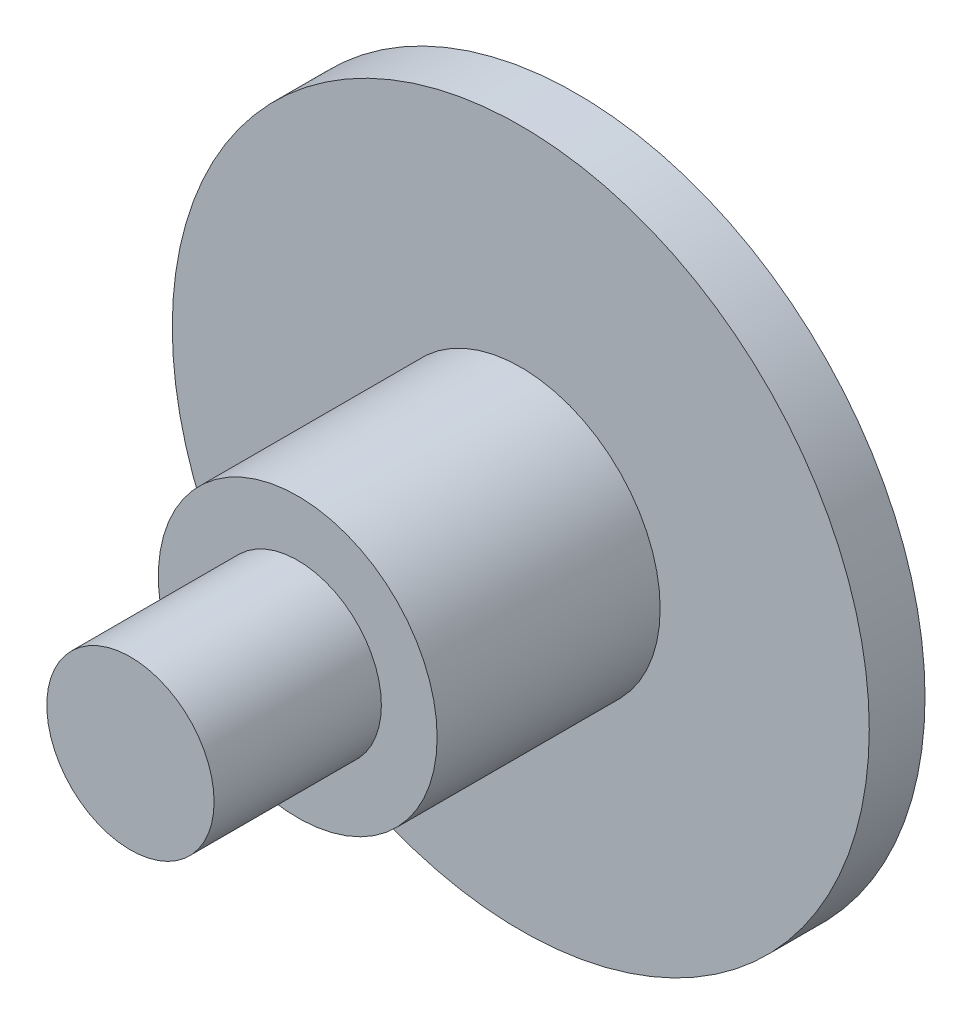
ISO-10303-21;
HEADER;
FILE_DESCRIPTION(('STEP AP214'),'2;1');
FILE_NAME('part.step','',(''),(''),'','','');
FILE_SCHEMA(('AUTOMOTIVE_DESIGN { 1 0 10303 214 1 1 1 1 }'));
ENDSEC;
DATA;
#1=APPLICATION_CONTEXT('core data for automotive mechanical design processes');
#2=APPLICATION_PROTOCOL_DEFINITION('international standard','automotive_design',2000,#1);
#3=PRODUCT_CONTEXT('',#1,'mechanical');
#4=PRODUCT('Part','Part','',(#3));
#5=PRODUCT_RELATED_PRODUCT_CATEGORY('part','',(#4));
#6=PRODUCT_DEFINITION_FORMATION('','',#4);
#7=PRODUCT_DEFINITION_CONTEXT('part definition',#1,'design');
#8=PRODUCT_DEFINITION('design','',#6,#7);
#9=PRODUCT_DEFINITION_SHAPE('','',#8);
#10=(LENGTH_UNIT() NAMED_UNIT(*) SI_UNIT(.MILLI.,.METRE.));
#11=(NAMED_UNIT(*) PLANE_ANGLE_UNIT() SI_UNIT($,.RADIAN.));
#12=(NAMED_UNIT(*) SI_UNIT($,.STERADIAN.) SOLID_ANGLE_UNIT());
#13=UNCERTAINTY_MEASURE_WITH_UNIT(LENGTH_MEASURE(1.E-05),#10,'distance_accuracy_value','');
#14=(GEOMETRIC_REPRESENTATION_CONTEXT(3) GLOBAL_UNCERTAINTY_ASSIGNED_CONTEXT((#13)) GLOBAL_UNIT_ASSIGNED_CONTEXT((#10,
#11,#12)) REPRESENTATION_CONTEXT('',''));
#15=CARTESIAN_POINT('',(0.,0.,0.));
#16=DIRECTION('',(0.,0.,1.));
#17=DIRECTION('',(1.,0.,0.));
#18=AXIS2_PLACEMENT_3D('',#15,#16,#17);
#19=CARTESIAN_POINT('',(0.,0.,2.));
#20=DIRECTION('',(0.,0.,-1.));
#21=DIRECTION('',(-1.,0.,0.));
#22=AXIS2_PLACEMENT_3D('',#19,#20,#21);
#23=CYLINDRICAL_SURFACE('',#22,12.5);
#24=CARTESIAN_POINT('',(0.,0.,2.));
#25=DIRECTION('',(0.,0.,1.));
#26=DIRECTION('',(1.,0.,0.));
#27=AXIS2_PLACEMENT_3D('',#24,#25,#26);
#28=CIRCLE('',#27,12.5);
#29=CARTESIAN_POINT('',(12.5,0.,2.));
#30=VERTEX_POINT('',#29);
#31=EDGE_CURVE('E10',#30,#30,#28,.T.);
#32=ORIENTED_EDGE('',*,*,#31,.F.);
#33=EDGE_LOOP('',(#32));
#34=FACE_BOUND('',#33,.T.);
#35=CARTESIAN_POINT('',(0.,0.,0.));
#36=DIRECTION('',(0.,0.,1.));
#37=DIRECTION('',(1.,0.,0.));
#38=AXIS2_PLACEMENT_3D('',#35,#36,#37);
#39=CIRCLE('',#38,12.5);
#40=CARTESIAN_POINT('',(12.5,0.,0.));
#41=VERTEX_POINT('',#40);
#42=EDGE_CURVE('E45',#41,#41,#39,.T.);
#43=ORIENTED_EDGE('',*,*,#42,.T.);
#44=EDGE_LOOP('',(#43));
#45=FACE_BOUND('',#44,.T.);
#46=ADVANCED_FACE('F37',(#34,#45),#23,.T.);
#47=CARTESIAN_POINT('',(0.,0.,2.));
#48=DIRECTION('',(0.,0.,1.));
#49=DIRECTION('',(1.,0.,0.));
#50=AXIS2_PLACEMENT_3D('',#47,#48,#49);
#51=PLANE('',#50);
#52=CARTESIAN_POINT('',(0.,0.,2.));
#53=DIRECTION('',(0.,0.,1.));
#54=DIRECTION('',(1.,0.,0.));
#55=AXIS2_PLACEMENT_3D('',#52,#53,#54);
#56=CIRCLE('',#55,5.);
#57=CARTESIAN_POINT('',(5.,0.,2.));
#58=VERTEX_POINT('',#57);
#59=EDGE_CURVE('E56',#58,#58,#56,.T.);
#60=ORIENTED_EDGE('',*,*,#59,.F.);
#61=EDGE_LOOP('',(#60));
#62=FACE_BOUND('',#61,.T.);
#63=ORIENTED_EDGE('',*,*,#31,.T.);
#64=EDGE_LOOP('',(#63));
#65=FACE_BOUND('',#64,.T.);
#66=ADVANCED_FACE('F87',(#62,#65),#51,.T.);
#67=CARTESIAN_POINT('',(0.,0.,0.));
#68=DIRECTION('',(0.,0.,1.));
#69=DIRECTION('',(1.,0.,0.));
#70=AXIS2_PLACEMENT_3D('',#67,#68,#69);
#71=PLANE('',#70);
#72=ORIENTED_EDGE('',*,*,#42,.F.);
#73=EDGE_LOOP('',(#72));
#74=FACE_BOUND('',#73,.T.);
#75=ADVANCED_FACE('F83',(#74),#71,.F.);
#76=CARTESIAN_POINT('',(0.,0.,10.));
#77=DIRECTION('',(0.,0.,-1.));
#78=DIRECTION('',(-1.,0.,0.));
#79=AXIS2_PLACEMENT_3D('',#76,#77,#78);
#80=CYLINDRICAL_SURFACE('',#79,5.);
#81=CARTESIAN_POINT('',(0.,0.,10.));
#82=DIRECTION('',(0.,0.,1.));
#83=DIRECTION('',(1.,0.,0.));
#84=AXIS2_PLACEMENT_3D('',#81,#82,#83);
#85=CIRCLE('',#84,5.);
#86=CARTESIAN_POINT('',(5.,0.,10.));
#87=VERTEX_POINT('',#86);
#88=EDGE_CURVE('E60',#87,#87,#85,.T.);
#89=ORIENTED_EDGE('',*,*,#88,.F.);
#90=EDGE_LOOP('',(#89));
#91=FACE_BOUND('',#90,.T.);
#92=ORIENTED_EDGE('',*,*,#59,.T.);
#93=EDGE_LOOP('',(#92));
#94=FACE_BOUND('',#93,.T.);
#95=ADVANCED_FACE('F75',(#91,#94),#80,.T.);
#96=CARTESIAN_POINT('',(0.,0.,10.));
#97=DIRECTION('',(0.,0.,1.));
#98=DIRECTION('',(1.,0.,0.));
#99=AXIS2_PLACEMENT_3D('',#96,#97,#98);
#100=PLANE('',#99);
#101=CARTESIAN_POINT('',(0.,0.,10.));
#102=DIRECTION('',(0.,0.,1.));
#103=DIRECTION('',(1.,0.,0.));
#104=AXIS2_PLACEMENT_3D('',#101,#102,#103);
#105=CIRCLE('',#104,3.);
#106=CARTESIAN_POINT('',(3.,0.,10.));
#107=VERTEX_POINT('',#106);
#108=EDGE_CURVE('E40',#107,#107,#105,.T.);
#109=ORIENTED_EDGE('',*,*,#108,.F.);
#110=EDGE_LOOP('',(#109));
#111=FACE_BOUND('',#110,.T.);
#112=ORIENTED_EDGE('',*,*,#88,.T.);
#113=EDGE_LOOP('',(#112));
#114=FACE_BOUND('',#113,.T.);
#115=ADVANCED_FACE('F72',(#111,#114),#100,.T.);
#116=CARTESIAN_POINT('',(0.,0.,16.));
#117=DIRECTION('',(0.,0.,1.));
#118=DIRECTION('',(1.,0.,0.));
#119=AXIS2_PLACEMENT_3D('',#116,#117,#118);
#120=PLANE('',#119);
#121=CARTESIAN_POINT('',(0.,0.,16.));
#122=DIRECTION('',(0.,0.,1.));
#123=DIRECTION('',(1.,0.,0.));
#124=AXIS2_PLACEMENT_3D('',#121,#122,#123);
#125=CIRCLE('',#124,3.);
#126=CARTESIAN_POINT('',(3.,0.,16.));
#127=VERTEX_POINT('',#126);
#128=EDGE_CURVE('E51',#127,#127,#125,.T.);
#129=ORIENTED_EDGE('',*,*,#128,.T.);
#130=EDGE_LOOP('',(#129));
#131=FACE_BOUND('',#130,.T.);
#132=ADVANCED_FACE('F74',(#131),#120,.T.);
#133=CARTESIAN_POINT('',(0.,0.,16.));
#134=DIRECTION('',(0.,0.,-1.));
#135=DIRECTION('',(-1.,0.,0.));
#136=AXIS2_PLACEMENT_3D('',#133,#134,#135);
#137=CYLINDRICAL_SURFACE('',#136,3.);
#138=ORIENTED_EDGE('',*,*,#108,.T.);
#139=EDGE_LOOP('',(#138));
#140=FACE_BOUND('',#139,.T.);
#141=ORIENTED_EDGE('',*,*,#128,.F.);
#142=EDGE_LOOP('',(#141));
#143=FACE_BOUND('',#142,.T.);
#144=ADVANCED_FACE('F69',(#140,#143),#137,.T.);
#145=CLOSED_SHELL('',(#46,#66,#75,#95,#115,#132,#144));
#146=MANIFOLD_SOLID_BREP('B2',#145);
#147=ADVANCED_BREP_SHAPE_REPRESENTATION('',(#18,#146),#14);
#148=SHAPE_DEFINITION_REPRESENTATION(#9,#147);
ENDSEC;
END-ISO-10303-21;
